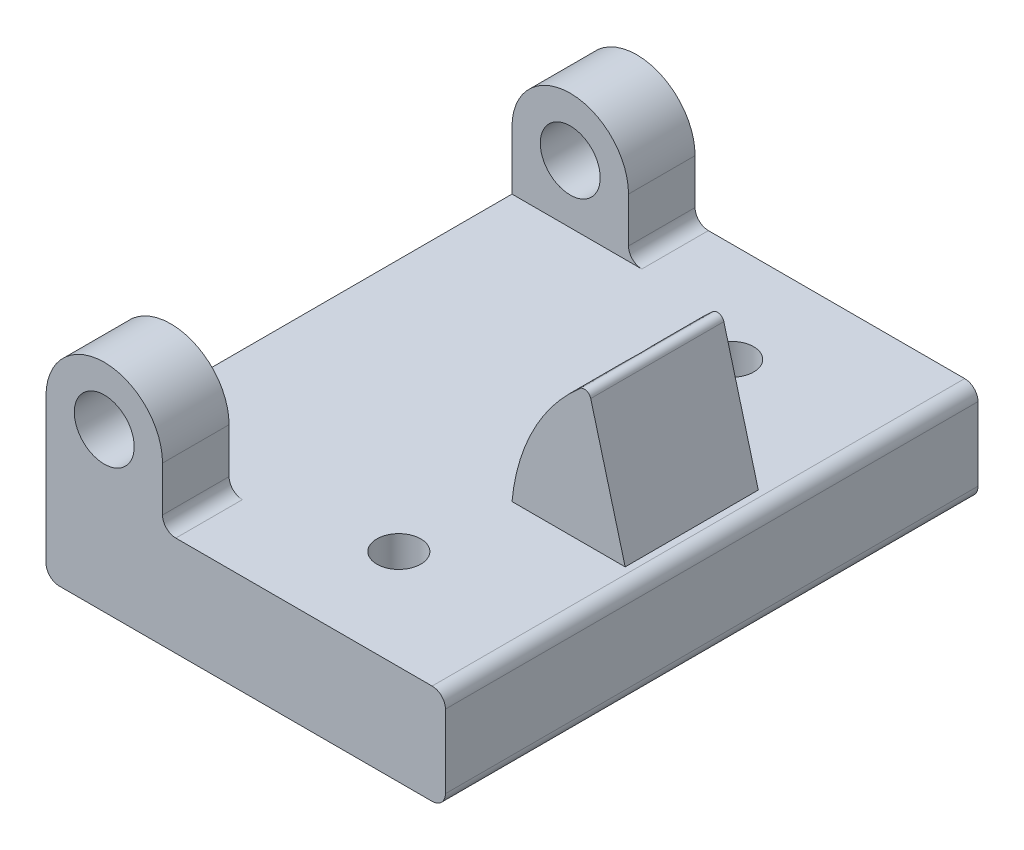
ISO-10303-21;
HEADER;
FILE_DESCRIPTION(('STEP AP214'),'2;1');
FILE_NAME('part.step','',(''),(''),'','','');
FILE_SCHEMA(('AUTOMOTIVE_DESIGN { 1 0 10303 214 1 1 1 1 }'));
ENDSEC;
DATA;
#1=APPLICATION_CONTEXT('core data for automotive mechanical design processes');
#2=APPLICATION_PROTOCOL_DEFINITION('international standard','automotive_design',2000,#1);
#3=PRODUCT_CONTEXT('',#1,'mechanical');
#4=PRODUCT('Part','Part','',(#3));
#5=PRODUCT_RELATED_PRODUCT_CATEGORY('part','',(#4));
#6=PRODUCT_DEFINITION_FORMATION('','',#4);
#7=PRODUCT_DEFINITION_CONTEXT('part definition',#1,'design');
#8=PRODUCT_DEFINITION('design','',#6,#7);
#9=PRODUCT_DEFINITION_SHAPE('','',#8);
#10=(LENGTH_UNIT() NAMED_UNIT(*) SI_UNIT(.MILLI.,.METRE.));
#11=(NAMED_UNIT(*) PLANE_ANGLE_UNIT() SI_UNIT($,.RADIAN.));
#12=(NAMED_UNIT(*) SI_UNIT($,.STERADIAN.) SOLID_ANGLE_UNIT());
#13=UNCERTAINTY_MEASURE_WITH_UNIT(LENGTH_MEASURE(1.E-05),#10,'distance_accuracy_value','');
#14=(GEOMETRIC_REPRESENTATION_CONTEXT(3) GLOBAL_UNCERTAINTY_ASSIGNED_CONTEXT((#13)) GLOBAL_UNIT_ASSIGNED_CONTEXT((#10,
#11,#12)) REPRESENTATION_CONTEXT('',''));
#15=CARTESIAN_POINT('',(0.,0.,0.));
#16=DIRECTION('',(0.,0.,1.));
#17=DIRECTION('',(1.,0.,0.));
#18=AXIS2_PLACEMENT_3D('',#15,#16,#17);
#19=CARTESIAN_POINT('',(58.,15.,-10.));
#20=DIRECTION('',(0.,1.,0.));
#21=DIRECTION('',(-1.,0.,0.));
#22=AXIS2_PLACEMENT_3D('',#19,#20,#21);
#23=PLANE('',#22);
#24=CARTESIAN_POINT('',(38.,15.,-15.));
#25=DIRECTION('',(0.,1.,0.));
#26=DIRECTION('',(0.,0.,1.));
#27=AXIS2_PLACEMENT_3D('',#24,#25,#26);
#28=CIRCLE('',#27,3.29999999999998);
#29=CARTESIAN_POINT('',(38.,15.,-11.7));
#30=VERTEX_POINT('',#29);
#31=EDGE_CURVE('E486',#30,#30,#28,.T.);
#32=ORIENTED_EDGE('',*,*,#31,.F.);
#33=EDGE_LOOP('',(#32));
#34=FACE_BOUND('',#33,.T.);
#35=CARTESIAN_POINT('',(38.,15.,-65.));
#36=DIRECTION('',(0.,1.,0.));
#37=DIRECTION('',(0.,0.,1.));
#38=AXIS2_PLACEMENT_3D('',#35,#36,#37);
#39=CIRCLE('',#38,3.29999999999998);
#40=CARTESIAN_POINT('',(38.,15.,-61.7));
#41=VERTEX_POINT('',#40);
#42=EDGE_CURVE('E183',#41,#41,#39,.T.);
#43=ORIENTED_EDGE('',*,*,#42,.F.);
#44=EDGE_LOOP('',(#43));
#45=FACE_BOUND('',#44,.T.);
#46=DIRECTION('',(-1.,0.,0.));
#47=VECTOR('',#46,1.);
#48=CARTESIAN_POINT('',(58.,15.,0.));
#49=LINE('',#48,#47);
#50=CARTESIAN_POINT('',(58.,15.,0.));
#51=VERTEX_POINT('',#50);
#52=CARTESIAN_POINT('',(19.5,15.,0.));
#53=VERTEX_POINT('',#52);
#54=EDGE_CURVE('E313',#51,#53,#49,.T.);
#55=ORIENTED_EDGE('',*,*,#54,.F.);
#56=DIRECTION('',(0.,0.,1.));
#57=VECTOR('',#56,1.);
#58=CARTESIAN_POINT('',(58.,15.,-10.));
#59=LINE('',#58,#57);
#60=CARTESIAN_POINT('',(58.,15.,-80.));
#61=VERTEX_POINT('',#60);
#62=EDGE_CURVE('E324',#61,#51,#59,.T.);
#63=ORIENTED_EDGE('',*,*,#62,.F.);
#64=DIRECTION('',(-1.,0.,0.));
#65=VECTOR('',#64,1.);
#66=CARTESIAN_POINT('',(58.,15.,-80.));
#67=LINE('',#66,#65);
#68=CARTESIAN_POINT('',(19.5,15.,-80.));
#69=VERTEX_POINT('',#68);
#70=EDGE_CURVE('E242',#61,#69,#67,.T.);
#71=ORIENTED_EDGE('',*,*,#70,.T.);
#72=DIRECTION('',(0.,0.,-1.));
#73=VECTOR('',#72,1.);
#74=CARTESIAN_POINT('',(19.5,15.,-70.));
#75=LINE('',#74,#73);
#76=CARTESIAN_POINT('',(19.5,15.,-70.));
#77=VERTEX_POINT('',#76);
#78=EDGE_CURVE('E265',#77,#69,#75,.T.);
#79=ORIENTED_EDGE('',*,*,#78,.F.);
#80=DIRECTION('',(1.,0.,0.));
#81=VECTOR('',#80,1.);
#82=CARTESIAN_POINT('',(58.,15.,-70.));
#83=LINE('',#82,#81);
#84=CARTESIAN_POINT('',(0.,15.,-70.));
#85=VERTEX_POINT('',#84);
#86=EDGE_CURVE('E264',#85,#77,#83,.T.);
#87=ORIENTED_EDGE('',*,*,#86,.F.);
#88=DIRECTION('',(0.,0.,1.));
#89=VECTOR('',#88,1.);
#90=CARTESIAN_POINT('',(0.,15.,-40.));
#91=LINE('',#90,#89);
#92=CARTESIAN_POINT('',(0.,15.,-10.));
#93=VERTEX_POINT('',#92);
#94=EDGE_CURVE('E276',#85,#93,#91,.T.);
#95=ORIENTED_EDGE('',*,*,#94,.T.);
#96=DIRECTION('',(1.,0.,0.));
#97=VECTOR('',#96,1.);
#98=CARTESIAN_POINT('',(58.,15.,-10.));
#99=LINE('',#98,#97);
#100=CARTESIAN_POINT('',(19.5,15.,-10.));
#101=VERTEX_POINT('',#100);
#102=EDGE_CURVE('E274',#93,#101,#99,.T.);
#103=ORIENTED_EDGE('',*,*,#102,.T.);
#104=DIRECTION('',(0.,0.,1.));
#105=VECTOR('',#104,1.);
#106=CARTESIAN_POINT('',(19.5,15.,-10.));
#107=LINE('',#106,#105);
#108=EDGE_CURVE('E322',#101,#53,#107,.T.);
#109=ORIENTED_EDGE('',*,*,#108,.T.);
#110=EDGE_LOOP('',(#55,#63,#71,#79,#87,#95,#103,#109));
#111=FACE_BOUND('',#110,.T.);
#112=DIRECTION('',(0.,0.,1.));
#113=VECTOR('',#112,1.);
#114=CARTESIAN_POINT('',(40.,15.,-50.));
#115=LINE('',#114,#113);
#116=CARTESIAN_POINT('',(40.,15.,-50.));
#117=VERTEX_POINT('',#116);
#118=CARTESIAN_POINT('',(40.,15.,-30.));
#119=VERTEX_POINT('',#118);
#120=EDGE_CURVE('E59',#117,#119,#115,.T.);
#121=ORIENTED_EDGE('',*,*,#120,.F.);
#122=DIRECTION('',(-1.,0.,0.));
#123=VECTOR('',#122,1.);
#124=CARTESIAN_POINT('',(57.,15.,-50.));
#125=LINE('',#124,#123);
#126=CARTESIAN_POINT('',(57.,15.,-50.));
#127=VERTEX_POINT('',#126);
#128=EDGE_CURVE('E54',#127,#117,#125,.T.);
#129=ORIENTED_EDGE('',*,*,#128,.F.);
#130=DIRECTION('',(0.,0.,1.));
#131=VECTOR('',#130,1.);
#132=CARTESIAN_POINT('',(57.,15.,-50.));
#133=LINE('',#132,#131);
#134=CARTESIAN_POINT('',(57.,15.,-30.));
#135=VERTEX_POINT('',#134);
#136=EDGE_CURVE('E221',#127,#135,#133,.T.);
#137=ORIENTED_EDGE('',*,*,#136,.T.);
#138=DIRECTION('',(-1.,0.,0.));
#139=VECTOR('',#138,1.);
#140=CARTESIAN_POINT('',(57.,15.,-30.));
#141=LINE('',#140,#139);
#142=EDGE_CURVE('E210',#135,#119,#141,.T.);
#143=ORIENTED_EDGE('',*,*,#142,.T.);
#144=EDGE_LOOP('',(#121,#129,#137,#143));
#145=FACE_BOUND('',#144,.T.);
#146=ADVANCED_FACE('F32',(#34,#45,#111,#145),#23,.T.);
#147=CARTESIAN_POINT('',(8.75,23.75,-10.));
#148=DIRECTION('',(0.,0.,1.));
#149=DIRECTION('',(1.,0.,0.));
#150=AXIS2_PLACEMENT_3D('',#147,#148,#149);
#151=PLANE('',#150);
#152=CARTESIAN_POINT('',(8.75,23.75,-10.));
#153=DIRECTION('',(0.,0.,1.));
#154=DIRECTION('',(1.,0.,0.));
#155=AXIS2_PLACEMENT_3D('',#152,#153,#154);
#156=CIRCLE('',#155,4.49999999999998);
#157=CARTESIAN_POINT('',(13.25,23.75,-10.));
#158=VERTEX_POINT('',#157);
#159=EDGE_CURVE('E195',#158,#158,#156,.T.);
#160=ORIENTED_EDGE('',*,*,#159,.T.);
#161=EDGE_LOOP('',(#160));
#162=FACE_BOUND('',#161,.T.);
#163=ORIENTED_EDGE('',*,*,#102,.F.);
#164=DIRECTION('',(0.,-1.,0.));
#165=VECTOR('',#164,1.);
#166=CARTESIAN_POINT('',(0.,23.75,-10.));
#167=LINE('',#166,#165);
#168=CARTESIAN_POINT('',(0.,23.75,-10.));
#169=VERTEX_POINT('',#168);
#170=EDGE_CURVE('E282',#169,#93,#167,.T.);
#171=ORIENTED_EDGE('',*,*,#170,.F.);
#172=CARTESIAN_POINT('',(8.75,23.75,-10.));
#173=DIRECTION('',(0.,0.,1.));
#174=DIRECTION('',(1.,0.,0.));
#175=AXIS2_PLACEMENT_3D('',#172,#173,#174);
#176=CIRCLE('',#175,8.75);
#177=CARTESIAN_POINT('',(17.5,23.75,-10.));
#178=VERTEX_POINT('',#177);
#179=EDGE_CURVE('E279',#178,#169,#176,.T.);
#180=ORIENTED_EDGE('',*,*,#179,.F.);
#181=DIRECTION('',(0.,1.,0.));
#182=VECTOR('',#181,1.);
#183=CARTESIAN_POINT('',(17.5,17.,-10.));
#184=LINE('',#183,#182);
#185=CARTESIAN_POINT('',(17.5,17.,-10.));
#186=VERTEX_POINT('',#185);
#187=EDGE_CURVE('E289',#186,#178,#184,.T.);
#188=ORIENTED_EDGE('',*,*,#187,.F.);
#189=CARTESIAN_POINT('',(19.5,17.,-10.));
#190=DIRECTION('',(0.,0.,-1.));
#191=DIRECTION('',(-1.,0.,0.));
#192=AXIS2_PLACEMENT_3D('',#189,#190,#191);
#193=CIRCLE('',#192,2.);
#194=EDGE_CURVE('E286',#101,#186,#193,.T.);
#195=ORIENTED_EDGE('',*,*,#194,.F.);
#196=EDGE_LOOP('',(#163,#171,#180,#188,#195));
#197=FACE_BOUND('',#196,.T.);
#198=ADVANCED_FACE('F352',(#162,#197),#151,.F.);
#199=CARTESIAN_POINT('',(8.75,23.75,-10.));
#200=DIRECTION('',(0.,0.,1.));
#201=DIRECTION('',(1.,0.,0.));
#202=AXIS2_PLACEMENT_3D('',#199,#200,#201);
#203=CYLINDRICAL_SURFACE('',#202,8.75);
#204=CARTESIAN_POINT('',(8.75,23.75,0.));
#205=DIRECTION('',(0.,0.,1.));
#206=DIRECTION('',(1.,0.,0.));
#207=AXIS2_PLACEMENT_3D('',#204,#205,#206);
#208=CIRCLE('',#207,8.75);
#209=CARTESIAN_POINT('',(17.5,23.75,0.));
#210=VERTEX_POINT('',#209);
#211=CARTESIAN_POINT('',(0.,23.75,0.));
#212=VERTEX_POINT('',#211);
#213=EDGE_CURVE('E278',#210,#212,#208,.T.);
#214=ORIENTED_EDGE('',*,*,#213,.F.);
#215=DIRECTION('',(0.,0.,1.));
#216=VECTOR('',#215,1.);
#217=CARTESIAN_POINT('',(17.5,23.75,-10.));
#218=LINE('',#217,#216);
#219=EDGE_CURVE('E11',#178,#210,#218,.T.);
#220=ORIENTED_EDGE('',*,*,#219,.F.);
#221=ORIENTED_EDGE('',*,*,#179,.T.);
#222=DIRECTION('',(0.,0.,1.));
#223=VECTOR('',#222,1.);
#224=CARTESIAN_POINT('',(0.,23.75,-10.));
#225=LINE('',#224,#223);
#226=EDGE_CURVE('E292',#169,#212,#225,.T.);
#227=ORIENTED_EDGE('',*,*,#226,.T.);
#228=EDGE_LOOP('',(#214,#220,#221,#227));
#229=FACE_BOUND('',#228,.T.);
#230=ADVANCED_FACE('F34',(#229),#203,.T.);
#231=CARTESIAN_POINT('',(17.5,17.,-10.));
#232=DIRECTION('',(1.,0.,0.));
#233=DIRECTION('',(0.,0.,-1.));
#234=AXIS2_PLACEMENT_3D('',#231,#232,#233);
#235=PLANE('',#234);
#236=DIRECTION('',(0.,1.,0.));
#237=VECTOR('',#236,1.);
#238=CARTESIAN_POINT('',(17.5,17.,0.));
#239=LINE('',#238,#237);
#240=CARTESIAN_POINT('',(17.5,17.,0.));
#241=VERTEX_POINT('',#240);
#242=EDGE_CURVE('E283',#241,#210,#239,.T.);
#243=ORIENTED_EDGE('',*,*,#242,.F.);
#244=DIRECTION('',(0.,0.,1.));
#245=VECTOR('',#244,1.);
#246=CARTESIAN_POINT('',(17.5,17.,-10.));
#247=LINE('',#246,#245);
#248=EDGE_CURVE('E46',#186,#241,#247,.T.);
#249=ORIENTED_EDGE('',*,*,#248,.F.);
#250=ORIENTED_EDGE('',*,*,#187,.T.);
#251=ORIENTED_EDGE('',*,*,#219,.T.);
#252=EDGE_LOOP('',(#243,#249,#250,#251));
#253=FACE_BOUND('',#252,.T.);
#254=ADVANCED_FACE('F348',(#253),#235,.T.);
#255=CARTESIAN_POINT('',(19.5,17.,-10.));
#256=DIRECTION('',(0.,0.,1.));
#257=DIRECTION('',(1.,0.,0.));
#258=AXIS2_PLACEMENT_3D('',#255,#256,#257);
#259=CYLINDRICAL_SURFACE('',#258,2.);
#260=CARTESIAN_POINT('',(19.5,17.,0.));
#261=DIRECTION('',(0.,0.,-1.));
#262=DIRECTION('',(-1.,0.,0.));
#263=AXIS2_PLACEMENT_3D('',#260,#261,#262);
#264=CIRCLE('',#263,2.);
#265=EDGE_CURVE('E316',#53,#241,#264,.T.);
#266=ORIENTED_EDGE('',*,*,#265,.F.);
#267=ORIENTED_EDGE('',*,*,#108,.F.);
#268=ORIENTED_EDGE('',*,*,#194,.T.);
#269=ORIENTED_EDGE('',*,*,#248,.T.);
#270=EDGE_LOOP('',(#266,#267,#268,#269));
#271=FACE_BOUND('',#270,.T.);
#272=ADVANCED_FACE('F392',(#271),#259,.F.);
#273=CARTESIAN_POINT('',(58.,13.,-10.));
#274=DIRECTION('',(0.,0.,1.));
#275=DIRECTION('',(1.,0.,0.));
#276=AXIS2_PLACEMENT_3D('',#273,#274,#275);
#277=CYLINDRICAL_SURFACE('',#276,2.);
#278=CARTESIAN_POINT('',(58.,13.,0.));
#279=DIRECTION('',(0.,0.,1.));
#280=DIRECTION('',(1.,0.,0.));
#281=AXIS2_PLACEMENT_3D('',#278,#279,#280);
#282=CIRCLE('',#281,2.);
#283=CARTESIAN_POINT('',(60.,13.,0.));
#284=VERTEX_POINT('',#283);
#285=EDGE_CURVE('E310',#284,#51,#282,.T.);
#286=ORIENTED_EDGE('',*,*,#285,.F.);
#287=DIRECTION('',(0.,0.,1.));
#288=VECTOR('',#287,1.);
#289=CARTESIAN_POINT('',(60.,13.,-10.));
#290=LINE('',#289,#288);
#291=CARTESIAN_POINT('',(60.,13.,-80.));
#292=VERTEX_POINT('',#291);
#293=EDGE_CURVE('E326',#292,#284,#290,.T.);
#294=ORIENTED_EDGE('',*,*,#293,.F.);
#295=CARTESIAN_POINT('',(58.,13.,-80.));
#296=DIRECTION('',(0.,0.,1.));
#297=DIRECTION('',(1.,0.,0.));
#298=AXIS2_PLACEMENT_3D('',#295,#296,#297);
#299=CIRCLE('',#298,2.);
#300=EDGE_CURVE('E244',#292,#61,#299,.T.);
#301=ORIENTED_EDGE('',*,*,#300,.T.);
#302=ORIENTED_EDGE('',*,*,#62,.T.);
#303=EDGE_LOOP('',(#286,#294,#301,#302));
#304=FACE_BOUND('',#303,.T.);
#305=ADVANCED_FACE('F387',(#304),#277,.T.);
#306=CARTESIAN_POINT('',(60.,2.,-10.));
#307=DIRECTION('',(1.,0.,0.));
#308=DIRECTION('',(0.,0.,-1.));
#309=AXIS2_PLACEMENT_3D('',#306,#307,#308);
#310=PLANE('',#309);
#311=DIRECTION('',(0.,1.,0.));
#312=VECTOR('',#311,1.);
#313=CARTESIAN_POINT('',(60.,2.,0.));
#314=LINE('',#313,#312);
#315=CARTESIAN_POINT('',(60.,2.,0.));
#316=VERTEX_POINT('',#315);
#317=EDGE_CURVE('E307',#316,#284,#314,.T.);
#318=ORIENTED_EDGE('',*,*,#317,.F.);
#319=DIRECTION('',(0.,0.,1.));
#320=VECTOR('',#319,1.);
#321=CARTESIAN_POINT('',(60.,2.,-10.));
#322=LINE('',#321,#320);
#323=CARTESIAN_POINT('',(60.,2.,-80.));
#324=VERTEX_POINT('',#323);
#325=EDGE_CURVE('E328',#324,#316,#322,.T.);
#326=ORIENTED_EDGE('',*,*,#325,.F.);
#327=DIRECTION('',(0.,1.,0.));
#328=VECTOR('',#327,1.);
#329=CARTESIAN_POINT('',(60.,2.,-80.));
#330=LINE('',#329,#328);
#331=EDGE_CURVE('E247',#324,#292,#330,.T.);
#332=ORIENTED_EDGE('',*,*,#331,.T.);
#333=ORIENTED_EDGE('',*,*,#293,.T.);
#334=EDGE_LOOP('',(#318,#326,#332,#333));
#335=FACE_BOUND('',#334,.T.);
#336=ADVANCED_FACE('F384',(#335),#310,.T.);
#337=CARTESIAN_POINT('',(58.,2.,-10.));
#338=DIRECTION('',(0.,0.,1.));
#339=DIRECTION('',(1.,0.,0.));
#340=AXIS2_PLACEMENT_3D('',#337,#338,#339);
#341=CYLINDRICAL_SURFACE('',#340,2.);
#342=CARTESIAN_POINT('',(58.,2.,0.));
#343=DIRECTION('',(0.,0.,1.));
#344=DIRECTION('',(1.,0.,0.));
#345=AXIS2_PLACEMENT_3D('',#342,#343,#344);
#346=CIRCLE('',#345,2.);
#347=CARTESIAN_POINT('',(58.,0.,0.));
#348=VERTEX_POINT('',#347);
#349=EDGE_CURVE('E304',#348,#316,#346,.T.);
#350=ORIENTED_EDGE('',*,*,#349,.F.);
#351=DIRECTION('',(0.,0.,1.));
#352=VECTOR('',#351,1.);
#353=CARTESIAN_POINT('',(58.,0.,-10.));
#354=LINE('',#353,#352);
#355=CARTESIAN_POINT('',(58.,0.,-80.));
#356=VERTEX_POINT('',#355);
#357=EDGE_CURVE('E330',#356,#348,#354,.T.);
#358=ORIENTED_EDGE('',*,*,#357,.F.);
#359=CARTESIAN_POINT('',(58.,2.,-80.));
#360=DIRECTION('',(0.,0.,1.));
#361=DIRECTION('',(1.,0.,0.));
#362=AXIS2_PLACEMENT_3D('',#359,#360,#361);
#363=CIRCLE('',#362,2.);
#364=EDGE_CURVE('E250',#356,#324,#363,.T.);
#365=ORIENTED_EDGE('',*,*,#364,.T.);
#366=ORIENTED_EDGE('',*,*,#325,.T.);
#367=EDGE_LOOP('',(#350,#358,#365,#366));
#368=FACE_BOUND('',#367,.T.);
#369=ADVANCED_FACE('F380',(#368),#341,.T.);
#370=CARTESIAN_POINT('',(2.00000000000001,0.,-10.));
#371=DIRECTION('',(0.,-1.,0.));
#372=DIRECTION('',(0.,0.,-1.));
#373=AXIS2_PLACEMENT_3D('',#370,#371,#372);
#374=PLANE('',#373);
#375=CARTESIAN_POINT('',(38.,0.,-15.));
#376=DIRECTION('',(0.,1.,0.));
#377=DIRECTION('',(0.,0.,1.));
#378=AXIS2_PLACEMENT_3D('',#375,#376,#377);
#379=CIRCLE('',#378,3.3);
#380=CARTESIAN_POINT('',(38.,0.,-11.7));
#381=VERTEX_POINT('',#380);
#382=EDGE_CURVE('E484',#381,#381,#379,.T.);
#383=ORIENTED_EDGE('',*,*,#382,.T.);
#384=EDGE_LOOP('',(#383));
#385=FACE_BOUND('',#384,.T.);
#386=CARTESIAN_POINT('',(38.,0.,-65.));
#387=DIRECTION('',(0.,1.,0.));
#388=DIRECTION('',(0.,0.,1.));
#389=AXIS2_PLACEMENT_3D('',#386,#387,#388);
#390=CIRCLE('',#389,3.3);
#391=CARTESIAN_POINT('',(38.,0.,-61.7));
#392=VERTEX_POINT('',#391);
#393=EDGE_CURVE('E178',#392,#392,#390,.T.);
#394=ORIENTED_EDGE('',*,*,#393,.T.);
#395=EDGE_LOOP('',(#394));
#396=FACE_BOUND('',#395,.T.);
#397=DIRECTION('',(1.,0.,0.));
#398=VECTOR('',#397,1.);
#399=CARTESIAN_POINT('',(2.00000000000001,0.,0.));
#400=LINE('',#399,#398);
#401=CARTESIAN_POINT('',(2.00000000000001,0.,0.));
#402=VERTEX_POINT('',#401);
#403=EDGE_CURVE('E301',#402,#348,#400,.T.);
#404=ORIENTED_EDGE('',*,*,#403,.F.);
#405=DIRECTION('',(0.,0.,1.));
#406=VECTOR('',#405,1.);
#407=CARTESIAN_POINT('',(2.00000000000001,0.,-10.));
#408=LINE('',#407,#406);
#409=CARTESIAN_POINT('',(2.00000000000001,0.,-80.));
#410=VERTEX_POINT('',#409);
#411=EDGE_CURVE('E332',#410,#402,#408,.T.);
#412=ORIENTED_EDGE('',*,*,#411,.F.);
#413=DIRECTION('',(1.,0.,0.));
#414=VECTOR('',#413,1.);
#415=CARTESIAN_POINT('',(2.00000000000001,0.,-80.));
#416=LINE('',#415,#414);
#417=EDGE_CURVE('E253',#410,#356,#416,.T.);
#418=ORIENTED_EDGE('',*,*,#417,.T.);
#419=ORIENTED_EDGE('',*,*,#357,.T.);
#420=EDGE_LOOP('',(#404,#412,#418,#419));
#421=FACE_BOUND('',#420,.T.);
#422=ADVANCED_FACE('F378',(#385,#396,#421),#374,.T.);
#423=CARTESIAN_POINT('',(2.,2.,-10.));
#424=DIRECTION('',(0.,0.,1.));
#425=DIRECTION('',(1.,0.,0.));
#426=AXIS2_PLACEMENT_3D('',#423,#424,#425);
#427=CYLINDRICAL_SURFACE('',#426,2.);
#428=CARTESIAN_POINT('',(2.,2.,0.));
#429=DIRECTION('',(0.,0.,1.));
#430=DIRECTION('',(1.,0.,0.));
#431=AXIS2_PLACEMENT_3D('',#428,#429,#430);
#432=CIRCLE('',#431,2.);
#433=CARTESIAN_POINT('',(0.,2.00000000000001,0.));
#434=VERTEX_POINT('',#433);
#435=EDGE_CURVE('E298',#434,#402,#432,.T.);
#436=ORIENTED_EDGE('',*,*,#435,.F.);
#437=DIRECTION('',(0.,0.,1.));
#438=VECTOR('',#437,1.);
#439=CARTESIAN_POINT('',(0.,2.00000000000001,-10.));
#440=LINE('',#439,#438);
#441=CARTESIAN_POINT('',(0.,2.00000000000001,-80.));
#442=VERTEX_POINT('',#441);
#443=EDGE_CURVE('E334',#442,#434,#440,.T.);
#444=ORIENTED_EDGE('',*,*,#443,.F.);
#445=CARTESIAN_POINT('',(2.,2.,-80.));
#446=DIRECTION('',(0.,0.,1.));
#447=DIRECTION('',(1.,0.,0.));
#448=AXIS2_PLACEMENT_3D('',#445,#446,#447);
#449=CIRCLE('',#448,2.);
#450=EDGE_CURVE('E256',#442,#410,#449,.T.);
#451=ORIENTED_EDGE('',*,*,#450,.T.);
#452=ORIENTED_EDGE('',*,*,#411,.T.);
#453=EDGE_LOOP('',(#436,#444,#451,#452));
#454=FACE_BOUND('',#453,.T.);
#455=ADVANCED_FACE('F374',(#454),#427,.T.);
#456=CARTESIAN_POINT('',(0.,23.75,-10.));
#457=DIRECTION('',(-1.,0.,0.));
#458=DIRECTION('',(0.,0.,1.));
#459=AXIS2_PLACEMENT_3D('',#456,#457,#458);
#460=PLANE('',#459);
#461=DIRECTION('',(0.,-1.,0.));
#462=VECTOR('',#461,1.);
#463=CARTESIAN_POINT('',(0.,23.75,0.));
#464=LINE('',#463,#462);
#465=EDGE_CURVE('E295',#212,#434,#464,.T.);
#466=ORIENTED_EDGE('',*,*,#465,.F.);
#467=ORIENTED_EDGE('',*,*,#226,.F.);
#468=ORIENTED_EDGE('',*,*,#170,.T.);
#469=ORIENTED_EDGE('',*,*,#94,.F.);
#470=DIRECTION('',(0.,-1.,0.));
#471=VECTOR('',#470,1.);
#472=CARTESIAN_POINT('',(0.,23.75,-70.));
#473=LINE('',#472,#471);
#474=CARTESIAN_POINT('',(0.,23.75,-70.));
#475=VERTEX_POINT('',#474);
#476=EDGE_CURVE('E232',#475,#85,#473,.T.);
#477=ORIENTED_EDGE('',*,*,#476,.F.);
#478=DIRECTION('',(0.,0.,-1.));
#479=VECTOR('',#478,1.);
#480=CARTESIAN_POINT('',(0.,23.75,-70.));
#481=LINE('',#480,#479);
#482=CARTESIAN_POINT('',(0.,23.75,-80.));
#483=VERTEX_POINT('',#482);
#484=EDGE_CURVE('E261',#475,#483,#481,.T.);
#485=ORIENTED_EDGE('',*,*,#484,.T.);
#486=DIRECTION('',(0.,-1.,0.));
#487=VECTOR('',#486,1.);
#488=CARTESIAN_POINT('',(0.,23.75,-80.));
#489=LINE('',#488,#487);
#490=EDGE_CURVE('E228',#483,#442,#489,.T.);
#491=ORIENTED_EDGE('',*,*,#490,.T.);
#492=ORIENTED_EDGE('',*,*,#443,.T.);
#493=EDGE_LOOP('',(#466,#467,#468,#469,#477,#485,#491,#492));
#494=FACE_BOUND('',#493,.T.);
#495=ADVANCED_FACE('F341',(#494),#460,.T.);
#496=CARTESIAN_POINT('',(8.75,23.75,0.));
#497=DIRECTION('',(0.,0.,1.));
#498=DIRECTION('',(1.,0.,0.));
#499=AXIS2_PLACEMENT_3D('',#496,#497,#498);
#500=PLANE('',#499);
#501=CARTESIAN_POINT('',(8.75,23.75,0.));
#502=DIRECTION('',(0.,0.,1.));
#503=DIRECTION('',(1.,0.,0.));
#504=AXIS2_PLACEMENT_3D('',#501,#502,#503);
#505=CIRCLE('',#504,4.49999999999999);
#506=CARTESIAN_POINT('',(13.25,23.75,0.));
#507=VERTEX_POINT('',#506);
#508=EDGE_CURVE('E181',#507,#507,#505,.T.);
#509=ORIENTED_EDGE('',*,*,#508,.F.);
#510=EDGE_LOOP('',(#509));
#511=FACE_BOUND('',#510,.T.);
#512=ORIENTED_EDGE('',*,*,#213,.T.);
#513=ORIENTED_EDGE('',*,*,#465,.T.);
#514=ORIENTED_EDGE('',*,*,#435,.T.);
#515=ORIENTED_EDGE('',*,*,#403,.T.);
#516=ORIENTED_EDGE('',*,*,#349,.T.);
#517=ORIENTED_EDGE('',*,*,#317,.T.);
#518=ORIENTED_EDGE('',*,*,#285,.T.);
#519=ORIENTED_EDGE('',*,*,#54,.T.);
#520=ORIENTED_EDGE('',*,*,#265,.T.);
#521=ORIENTED_EDGE('',*,*,#242,.T.);
#522=EDGE_LOOP('',(#512,#513,#514,#515,#516,#517,#518,#519,#520,#521));
#523=FACE_BOUND('',#522,.T.);
#524=ADVANCED_FACE('F344',(#511,#523),#500,.T.);
#525=CARTESIAN_POINT('',(8.75,23.75,-70.));
#526=DIRECTION('',(0.,0.,-1.));
#527=DIRECTION('',(-1.,0.,0.));
#528=AXIS2_PLACEMENT_3D('',#525,#526,#527);
#529=CYLINDRICAL_SURFACE('',#528,8.75);
#530=CARTESIAN_POINT('',(8.75,23.75,-80.));
#531=DIRECTION('',(0.,0.,1.));
#532=DIRECTION('',(1.,0.,0.));
#533=AXIS2_PLACEMENT_3D('',#530,#531,#532);
#534=CIRCLE('',#533,8.75);
#535=CARTESIAN_POINT('',(17.5,23.75,-80.));
#536=VERTEX_POINT('',#535);
#537=EDGE_CURVE('E223',#536,#483,#534,.T.);
#538=ORIENTED_EDGE('',*,*,#537,.T.);
#539=ORIENTED_EDGE('',*,*,#484,.F.);
#540=CARTESIAN_POINT('',(8.75,23.75,-70.));
#541=DIRECTION('',(0.,0.,1.));
#542=DIRECTION('',(1.,0.,0.));
#543=AXIS2_PLACEMENT_3D('',#540,#541,#542);
#544=CIRCLE('',#543,8.75);
#545=CARTESIAN_POINT('',(17.5,23.75,-70.));
#546=VERTEX_POINT('',#545);
#547=EDGE_CURVE('E224',#546,#475,#544,.T.);
#548=ORIENTED_EDGE('',*,*,#547,.F.);
#549=DIRECTION('',(0.,0.,-1.));
#550=VECTOR('',#549,1.);
#551=CARTESIAN_POINT('',(17.5,23.75,-70.));
#552=LINE('',#551,#550);
#553=EDGE_CURVE('E235',#546,#536,#552,.T.);
#554=ORIENTED_EDGE('',*,*,#553,.T.);
#555=EDGE_LOOP('',(#538,#539,#548,#554));
#556=FACE_BOUND('',#555,.T.);
#557=ADVANCED_FACE('F366',(#556),#529,.T.);
#558=CARTESIAN_POINT('',(19.5,17.,-70.));
#559=DIRECTION('',(0.,0.,-1.));
#560=DIRECTION('',(-1.,0.,0.));
#561=AXIS2_PLACEMENT_3D('',#558,#559,#560);
#562=CYLINDRICAL_SURFACE('',#561,2.);
#563=CARTESIAN_POINT('',(19.5,17.,-80.));
#564=DIRECTION('',(0.,0.,-1.));
#565=DIRECTION('',(-1.,0.,0.));
#566=AXIS2_PLACEMENT_3D('',#563,#564,#565);
#567=CIRCLE('',#566,2.);
#568=CARTESIAN_POINT('',(17.5,17.,-80.));
#569=VERTEX_POINT('',#568);
#570=EDGE_CURVE('E240',#69,#569,#567,.T.);
#571=ORIENTED_EDGE('',*,*,#570,.T.);
#572=DIRECTION('',(0.,0.,-1.));
#573=VECTOR('',#572,1.);
#574=CARTESIAN_POINT('',(17.5,17.,-70.));
#575=LINE('',#574,#573);
#576=CARTESIAN_POINT('',(17.5,17.,-70.));
#577=VERTEX_POINT('',#576);
#578=EDGE_CURVE('E268',#577,#569,#575,.T.);
#579=ORIENTED_EDGE('',*,*,#578,.F.);
#580=CARTESIAN_POINT('',(19.5,17.,-70.));
#581=DIRECTION('',(0.,0.,-1.));
#582=DIRECTION('',(-1.,0.,0.));
#583=AXIS2_PLACEMENT_3D('',#580,#581,#582);
#584=CIRCLE('',#583,2.);
#585=EDGE_CURVE('E230',#77,#577,#584,.T.);
#586=ORIENTED_EDGE('',*,*,#585,.F.);
#587=ORIENTED_EDGE('',*,*,#78,.T.);
#588=EDGE_LOOP('',(#571,#579,#586,#587));
#589=FACE_BOUND('',#588,.T.);
#590=ADVANCED_FACE('F429',(#589),#562,.F.);
#591=CARTESIAN_POINT('',(17.5,17.,-70.));
#592=DIRECTION('',(-1.,0.,0.));
#593=DIRECTION('',(0.,0.,1.));
#594=AXIS2_PLACEMENT_3D('',#591,#592,#593);
#595=PLANE('',#594);
#596=DIRECTION('',(0.,1.,0.));
#597=VECTOR('',#596,1.);
#598=CARTESIAN_POINT('',(17.5,17.,-80.));
#599=LINE('',#598,#597);
#600=EDGE_CURVE('E238',#569,#536,#599,.T.);
#601=ORIENTED_EDGE('',*,*,#600,.T.);
#602=ORIENTED_EDGE('',*,*,#553,.F.);
#603=DIRECTION('',(0.,1.,0.));
#604=VECTOR('',#603,1.);
#605=CARTESIAN_POINT('',(17.5,17.,-70.));
#606=LINE('',#605,#604);
#607=EDGE_CURVE('E227',#577,#546,#606,.T.);
#608=ORIENTED_EDGE('',*,*,#607,.F.);
#609=ORIENTED_EDGE('',*,*,#578,.T.);
#610=EDGE_LOOP('',(#601,#602,#608,#609));
#611=FACE_BOUND('',#610,.T.);
#612=ADVANCED_FACE('F433',(#611),#595,.F.);
#613=CARTESIAN_POINT('',(8.75,23.75,-70.));
#614=DIRECTION('',(0.,0.,-1.));
#615=DIRECTION('',(1.,0.,0.));
#616=AXIS2_PLACEMENT_3D('',#613,#614,#615);
#617=PLANE('',#616);
#618=CARTESIAN_POINT('',(8.75,23.75,-70.));
#619=DIRECTION('',(0.,0.,-1.));
#620=DIRECTION('',(-1.,0.,0.));
#621=AXIS2_PLACEMENT_3D('',#618,#619,#620);
#622=CIRCLE('',#621,4.49999999999998);
#623=CARTESIAN_POINT('',(4.25000000000002,23.75,-70.));
#624=VERTEX_POINT('',#623);
#625=EDGE_CURVE('E192',#624,#624,#622,.T.);
#626=ORIENTED_EDGE('',*,*,#625,.T.);
#627=EDGE_LOOP('',(#626));
#628=FACE_BOUND('',#627,.T.);
#629=ORIENTED_EDGE('',*,*,#476,.T.);
#630=ORIENTED_EDGE('',*,*,#86,.T.);
#631=ORIENTED_EDGE('',*,*,#585,.T.);
#632=ORIENTED_EDGE('',*,*,#607,.T.);
#633=ORIENTED_EDGE('',*,*,#547,.T.);
#634=EDGE_LOOP('',(#629,#630,#631,#632,#633));
#635=FACE_BOUND('',#634,.T.);
#636=ADVANCED_FACE('F360',(#628,#635),#617,.F.);
#637=CARTESIAN_POINT('',(8.75,23.75,-80.));
#638=DIRECTION('',(0.,0.,-1.));
#639=DIRECTION('',(1.,0.,0.));
#640=AXIS2_PLACEMENT_3D('',#637,#638,#639);
#641=PLANE('',#640);
#642=CARTESIAN_POINT('',(8.75,23.75,-80.));
#643=DIRECTION('',(0.,0.,1.));
#644=DIRECTION('',(1.,0.,0.));
#645=AXIS2_PLACEMENT_3D('',#642,#643,#644);
#646=CIRCLE('',#645,4.49999999999998);
#647=CARTESIAN_POINT('',(13.25,23.75,-80.));
#648=VERTEX_POINT('',#647);
#649=EDGE_CURVE('E189',#648,#648,#646,.T.);
#650=ORIENTED_EDGE('',*,*,#649,.T.);
#651=EDGE_LOOP('',(#650));
#652=FACE_BOUND('',#651,.T.);
#653=ORIENTED_EDGE('',*,*,#537,.F.);
#654=ORIENTED_EDGE('',*,*,#600,.F.);
#655=ORIENTED_EDGE('',*,*,#570,.F.);
#656=ORIENTED_EDGE('',*,*,#70,.F.);
#657=ORIENTED_EDGE('',*,*,#300,.F.);
#658=ORIENTED_EDGE('',*,*,#331,.F.);
#659=ORIENTED_EDGE('',*,*,#364,.F.);
#660=ORIENTED_EDGE('',*,*,#417,.F.);
#661=ORIENTED_EDGE('',*,*,#450,.F.);
#662=ORIENTED_EDGE('',*,*,#490,.F.);
#663=EDGE_LOOP('',(#653,#654,#655,#656,#657,#658,#659,#660,#661,#662));
#664=FACE_BOUND('',#663,.T.);
#665=ADVANCED_FACE('F371',(#652,#664),#641,.T.);
#666=CARTESIAN_POINT('',(57.,15.,-50.));
#667=DIRECTION('',(-0.965925826289069,-0.258819045102518,0.));
#668=DIRECTION('',(0.258819045102518,-0.965925826289069,0.));
#669=AXIS2_PLACEMENT_3D('',#666,#667,#668);
#670=PLANE('',#669);
#671=DIRECTION('',(0.258819045102518,-0.965925826289069,0.));
#672=VECTOR('',#671,1.);
#673=CARTESIAN_POINT('',(57.,15.,-30.));
#674=LINE('',#673,#672);
#675=CARTESIAN_POINT('',(51.8236190979497,34.3185165257814,-30.));
#676=VERTEX_POINT('',#675);
#677=EDGE_CURVE('E198',#676,#135,#674,.T.);
#678=ORIENTED_EDGE('',*,*,#677,.T.);
#679=ORIENTED_EDGE('',*,*,#136,.F.);
#680=DIRECTION('',(0.258819045102518,-0.965925826289069,0.));
#681=VECTOR('',#680,1.);
#682=CARTESIAN_POINT('',(57.,15.,-50.));
#683=LINE('',#682,#681);
#684=CARTESIAN_POINT('',(51.8236190979497,34.3185165257814,-50.));
#685=VERTEX_POINT('',#684);
#686=EDGE_CURVE('E199',#685,#127,#683,.T.);
#687=ORIENTED_EDGE('',*,*,#686,.F.);
#688=DIRECTION('',(0.,0.,1.));
#689=VECTOR('',#688,1.);
#690=CARTESIAN_POINT('',(51.8236190979497,34.3185165257814,-50.));
#691=LINE('',#690,#689);
#692=EDGE_CURVE('E207',#685,#676,#691,.T.);
#693=ORIENTED_EDGE('',*,*,#692,.T.);
#694=EDGE_LOOP('',(#678,#679,#687,#693));
#695=FACE_BOUND('',#694,.T.);
#696=ADVANCED_FACE('F442',(#695),#670,.F.);
#697=CARTESIAN_POINT('',(69.8649979450741,12.1571321274598,-50.));
#698=DIRECTION('',(0.,0.,1.));
#699=DIRECTION('',(1.,0.,0.));
#700=AXIS2_PLACEMENT_3D('',#697,#698,#699);
#701=CYLINDRICAL_SURFACE('',#700,30.);
#702=CARTESIAN_POINT('',(42.9648179094108,25.437957178973,-40.));
#703=CARTESIAN_POINT('',(42.9648131911691,25.4379467042636,-40.0960831979303));
#704=CARTESIAN_POINT('',(42.9687898575845,25.4460110852687,-40.1921379368443));
#705=CARTESIAN_POINT('',(42.984234009466,25.4772230858956,-40.3811633795309));
#706=CARTESIAN_POINT('',(42.9957098763967,25.500387582056,-40.4741305101323));
#707=CARTESIAN_POINT('',(43.0289749251226,25.5671872251038,-40.6786367661772));
#708=CARTESIAN_POINT('',(43.0526868666047,25.6146118926414,-40.7886004179525));
#709=CARTESIAN_POINT('',(43.1079953562329,25.7242454789378,-40.9987073970755));
#710=CARTESIAN_POINT('',(43.1396088175772,25.7864860974473,-41.098829008633));
#711=CARTESIAN_POINT('',(43.2029260314908,25.9098737595262,-41.273331330463));
#712=CARTESIAN_POINT('',(43.2337124499911,25.9694295124702,-41.3492033085922));
#713=CARTESIAN_POINT('',(43.2986434612005,26.0939086130787,-41.4949161958091));
#714=CARTESIAN_POINT('',(43.3327903885215,26.158835687244,-41.564752847868));
#715=CARTESIAN_POINT('',(43.4039335503149,26.2928258873361,-41.6990488406965));
#716=CARTESIAN_POINT('',(43.4409353384916,26.3618970137659,-41.7634971648497));
#717=CARTESIAN_POINT('',(43.5173439198117,26.5031277168723,-41.8874127720592));
#718=CARTESIAN_POINT('',(43.5567516018003,26.5752884320047,-41.9468781947225));
#719=CARTESIAN_POINT('',(43.673960639997,26.787741470906,-42.1125847087203));
#720=CARTESIAN_POINT('',(43.7545062345989,26.9311111539344,-42.2129610631862));
#721=CARTESIAN_POINT('',(43.9219292963643,27.2231741144034,-42.3997905217168));
#722=CARTESIAN_POINT('',(44.0088121048092,27.3718718275689,-42.4862316789447));
#723=CARTESIAN_POINT('',(44.1882442634677,27.6727706266492,-42.6466894713658));
#724=CARTESIAN_POINT('',(44.2808001123505,27.8249756008816,-42.7206914798518));
#725=CARTESIAN_POINT('',(44.4709629274615,28.1313457213295,-42.8570071379483));
#726=CARTESIAN_POINT('',(44.5685683953301,28.2855102759582,-42.9193242296985));
#727=CARTESIAN_POINT('',(44.7774584969052,28.6087469030464,-43.0378267885161));
#728=CARTESIAN_POINT('',(44.8891854101156,28.777917761229,-43.092963563568));
#729=CARTESIAN_POINT('',(45.1178712206782,29.1165387417157,-43.1900539283105));
#730=CARTESIAN_POINT('',(45.2348309023251,29.2859889021914,-43.232005534177));
#731=CARTESIAN_POINT('',(45.4735008314157,29.6241774708348,-43.3024242647298));
#732=CARTESIAN_POINT('',(45.5952078350163,29.7929162806455,-43.3309004283374));
#733=CARTESIAN_POINT('',(45.8429858589593,30.1289572825281,-43.3738083624569));
#734=CARTESIAN_POINT('',(45.9690562583534,30.2962596748197,-43.3882421228813));
#735=CARTESIAN_POINT('',(46.2120170369173,30.6117255022511,-43.4014543940615));
#736=CARTESIAN_POINT('',(46.3285420007723,30.7601094143877,-43.4016719542036));
#737=CARTESIAN_POINT('',(46.5641251046012,31.0543499374395,-43.3891659495406));
#738=CARTESIAN_POINT('',(46.6831834587783,31.2002063327411,-43.3764412861536));
#739=CARTESIAN_POINT('',(46.9229861697533,31.4884328493984,-43.3370007108455));
#740=CARTESIAN_POINT('',(47.0437289330839,31.6308059556565,-43.3102972510154));
#741=CARTESIAN_POINT('',(47.2859337536596,31.9111238556051,-43.2416740658284));
#742=CARTESIAN_POINT('',(47.4073955126541,32.0490703512906,-43.1997602669058));
#743=CARTESIAN_POINT('',(47.6979663040981,32.3731372483509,-43.0793195093465));
#744=CARTESIAN_POINT('',(47.8668421766222,32.5566339626308,-42.9928627321411));
#745=CARTESIAN_POINT('',(48.1980210169144,32.9080396119749,-42.7833086513057));
#746=CARTESIAN_POINT('',(48.3603331660017,33.0759707775472,-42.6602646925937));
#747=CARTESIAN_POINT('',(48.6330248351747,33.3522160711204,-42.4082999536884));
#748=CARTESIAN_POINT('',(48.7465181867321,33.4651647906355,-42.2878789914835));
#749=CARTESIAN_POINT('',(48.9599628678461,33.6746082302985,-42.0230400707759));
#750=CARTESIAN_POINT('',(49.0599311969173,33.7711236455777,-41.8786527537144));
#751=CARTESIAN_POINT('',(49.2235529522355,33.9273215808221,-41.5956189137497));
#752=CARTESIAN_POINT('',(49.2905031549689,33.9905150514326,-41.4608565034644));
#753=CARTESIAN_POINT('',(49.378389855032,34.0728913596827,-41.2487874704297));
#754=CARTESIAN_POINT('',(49.405602917748,34.0982878009135,-41.1764167234176));
#755=CARTESIAN_POINT('',(49.4554235882533,34.1446384126784,-41.0287410700539));
#756=CARTESIAN_POINT('',(49.4780331624286,34.16559448008,-40.9534374329341));
#757=CARTESIAN_POINT('',(49.5183893876516,34.2029091055868,-40.7998428164805));
#758=CARTESIAN_POINT('',(49.536101890469,34.2192353986764,-40.7215349920172));
#759=CARTESIAN_POINT('',(49.5661118985713,34.2468501272663,-40.5630499740225));
#760=CARTESIAN_POINT('',(49.5784119249255,34.2581409082834,-40.4828736691715));
#761=CARTESIAN_POINT('',(49.5973527915942,34.2755120117326,-40.3212997200542));
#762=CARTESIAN_POINT('',(49.6039944361699,34.2815930746554,-40.2399022510338));
#763=CARTESIAN_POINT('',(49.6114878334348,34.288452566376,-40.0766466136279));
#764=CARTESIAN_POINT('',(49.6123401443679,34.2892315064379,-39.9947884904233));
#765=CARTESIAN_POINT('',(49.6065849599287,34.283966385306,-39.7669990140992));
#766=CARTESIAN_POINT('',(49.5935880322813,34.2720787035551,-39.6212738340339));
#767=CARTESIAN_POINT('',(49.549828067205,34.2318850412031,-39.3349830521171));
#768=CARTESIAN_POINT('',(49.5190662964792,34.203580231207,-39.1944170831536));
#769=CARTESIAN_POINT('',(49.4415733034161,34.1318106280583,-38.9213361536346));
#770=CARTESIAN_POINT('',(49.3947889799852,34.0882954153751,-38.7888497121686));
#771=CARTESIAN_POINT('',(49.287800426465,33.9879434404875,-38.5348618524601));
#772=CARTESIAN_POINT('',(49.2275901647122,33.931100690234,-38.4133654061155));
#773=CARTESIAN_POINT('',(49.07108914579,33.7818635348805,-38.1382704526539));
#774=CARTESIAN_POINT('',(48.9698345235519,33.6842092256325,-37.990336150013));
#775=CARTESIAN_POINT('',(48.7531305061993,33.4717328527238,-37.7192762369814));
#776=CARTESIAN_POINT('',(48.6376544513851,33.3568784557716,-37.5961983984912));
#777=CARTESIAN_POINT('',(48.3545600517807,33.07015904721,-37.3341059963247));
#778=CARTESIAN_POINT('',(48.183161117905,32.8926760186722,-37.205363471986));
#779=CARTESIAN_POINT('',(47.8335057832801,32.5207958864205,-36.9882614193054));
#780=CARTESIAN_POINT('',(47.6552400658418,32.3263753165355,-36.8999590129139));
#781=CARTESIAN_POINT('',(47.3488164407987,31.9828387339014,-36.7789942524758));
#782=CARTESIAN_POINT('',(47.220797075718,31.8365259016687,-36.7376532150457));
#783=CARTESIAN_POINT('',(46.9658063302268,31.5392206728815,-36.6715816195074));
#784=CARTESIAN_POINT('',(46.8388354098031,31.3882263475656,-36.646858005476));
#785=CARTESIAN_POINT('',(46.5868544168795,31.0824428775174,-36.6125998072848));
#786=CARTESIAN_POINT('',(46.4618489198719,30.9276465596252,-36.6030966010168));
#787=CARTESIAN_POINT('',(46.2148679867776,30.6154900512945,-36.5981890133604));
#788=CARTESIAN_POINT('',(46.0928923808517,30.4581300053872,-36.6027838399069));
#789=CARTESIAN_POINT('',(45.8178532116495,30.0959268719224,-36.6283453950424));
#790=CARTESIAN_POINT('',(45.6659744532489,29.890483874889,-36.653653460213));
#791=CARTESIAN_POINT('',(45.3690880926255,29.4780735070159,-36.7246868515494));
#792=CARTESIAN_POINT('',(45.2240836402929,29.2711054866309,-36.7704214392604));
#793=CARTESIAN_POINT('',(44.9419288177533,28.8575277027697,-36.881534632206));
#794=CARTESIAN_POINT('',(44.8047681504626,28.6509178317328,-36.9468867449961));
#795=CARTESIAN_POINT('',(44.5388447030728,28.2396016500105,-37.0973366725859));
#796=CARTESIAN_POINT('',(44.4100766615374,28.0348942170513,-37.1824219608864));
#797=CARTESIAN_POINT('',(44.2210731035051,27.7264796002558,-37.3278992736586));
#798=CARTESIAN_POINT('',(44.1574667489754,27.6212081313794,-37.3806890828132));
#799=CARTESIAN_POINT('',(44.0329536442682,27.4123034712014,-37.4923318959836));
#800=CARTESIAN_POINT('',(43.9720464042399,27.3086699848439,-37.5511837933182));
#801=CARTESIAN_POINT('',(43.8531750869675,27.1036738532388,-37.6753994404959));
#802=CARTESIAN_POINT('',(43.7952102702786,27.0023106410744,-37.7407615419408));
#803=CARTESIAN_POINT('',(43.6825435060003,26.8026842607308,-37.8786430151234));
#804=CARTESIAN_POINT('',(43.6278407306925,26.7044203091444,-37.9511605587169));
#805=CARTESIAN_POINT('',(43.5374286083183,26.539940997288,-38.0821298412228));
#806=CARTESIAN_POINT('',(43.50079312244,26.4726591917448,-38.1386028159627));
#807=CARTESIAN_POINT('',(43.4296750176589,26.3409010084566,-38.2559888750915));
#808=CARTESIAN_POINT('',(43.3951918171856,26.2764238742991,-38.3169007503148));
#809=CARTESIAN_POINT('',(43.3287660405454,26.1511812018472,-38.4435115192117));
#810=CARTESIAN_POINT('',(43.2968190424675,26.0904092484472,-38.5092016806688));
#811=CARTESIAN_POINT('',(43.23588413864,25.9735946166729,-38.64589965224));
#812=CARTESIAN_POINT('',(43.206894447709,25.9175490887712,-38.7169042088901));
#813=CARTESIAN_POINT('',(43.1480252113297,25.8029430838484,-38.8768442747173));
#814=CARTESIAN_POINT('',(43.1187764828636,25.7454721181316,-38.9668125516606));
#815=CARTESIAN_POINT('',(43.0665072279296,25.6420962872275,-39.1549585885688));
#816=CARTESIAN_POINT('',(43.0434840463576,25.5961864919468,-39.2531328253517));
#817=CARTESIAN_POINT('',(43.0054099695245,25.519930340912,-39.4571223835133));
#818=CARTESIAN_POINT('',(42.9903661621198,25.4895978227778,-39.5629444037323));
#819=CARTESIAN_POINT('',(42.9700833676895,25.4486384122437,-39.7791970816907));
#820=CARTESIAN_POINT('',(42.9648233298399,25.4379692125701,-39.8896173209));
#821=CARTESIAN_POINT('',(42.9648179094108,25.437957178973,-40.));
#822=B_SPLINE_CURVE_WITH_KNOTS('',3,(#702,#703,#704,#705,#706,#707,#708,#709,#710,#711,#712,
#713,#714,#715,#716,#717,#718,#719,#720,#721,#722,#723,#724,#725,#726,#727,#728,#729,#730,#731,
#732,#733,#734,#735,#736,#737,#738,#739,#740,#741,#742,#743,#744,#745,#746,#747,#748,#749,#750,
#751,#752,#753,#754,#755,#756,#757,#758,#759,#760,#761,#762,#763,#764,#765,#766,#767,#768,#769,
#770,#771,#772,#773,#774,#775,#776,#777,#778,#779,#780,#781,#782,#783,#784,#785,#786,#787,#788,
#789,#790,#791,#792,#793,#794,#795,#796,#797,#798,#799,#800,#801,#802,#803,#804,#805,#806,#807,
#808,#809,#810,#811,#812,#813,#814,#815,#816,#817,#818,#819,#820,#821),.UNSPECIFIED.,.T.,.F.,(4,
2,2,2,2,2,2,2,2,2,2,2,2,2,2,2,2,2,2,2,2,2,2,2,2,2,2,2,2,2,2,2,2,2,2,2,2,2,2,2,2,2,2,2,2,2,2,2,2,
2,2,2,2,2,2,2,2,2,2,4),(0.,0.287809512552344,0.575941246190919,0.940130721887853,
1.30510652292876,1.60842977699386,1.91196526358737,2.21610688996861,2.52036156795354,
3.0974112444097,3.67495303244076,4.25316924933335,4.83121486693069,5.46102017898815,
6.09092020545938,6.72039711292814,7.34978480586594,7.9153518738284,8.48096695313906,
9.04607904668594,9.61097119048873,10.4001910364991,11.1882657782533,11.7871777194765,
12.3853297564905,12.8727671873769,13.1166551944526,13.360438804883,13.605881788698,
13.8512103266677,14.0965039887317,14.3417739977011,14.7798114676053,15.2178177075757,
15.6572898417555,16.0969598099836,16.706007751178,17.3162153162126,18.1465870292969,
18.9781280578782,19.5736584825508,20.1694376125763,20.7664434075682,21.363415661792,
22.1326353217402,22.9022041065233,23.6707382687736,24.4387858991346,24.8401821688039,
25.2415052899097,25.6427270521979,26.0438465704503,26.3292293828559,26.614534744906,
26.8993312183049,27.1839547438486,27.5151588759298,27.8462215307281,28.1775777688771,
28.5082202303097),.UNSPECIFIED.);
#823=CARTESIAN_POINT('',(42.9648179094108,25.437957178973,-40.));
#824=VERTEX_POINT('',#823);
#825=EDGE_CURVE('E36',#824,#824,#822,.T.);
#826=ORIENTED_EDGE('',*,*,#825,.T.);
#827=EDGE_LOOP('',(#826));
#828=FACE_BOUND('',#827,.T.);
#829=CARTESIAN_POINT('',(69.8649979450741,12.1571321274598,-30.));
#830=DIRECTION('',(0.,0.,-1.));
#831=DIRECTION('',(1.,0.,0.));
#832=AXIS2_PLACEMENT_3D('',#829,#830,#831);
#833=CIRCLE('',#832,30.);
#834=CARTESIAN_POINT('',(50.2022689725774,34.8149583549278,-30.));
#835=VERTEX_POINT('',#834);
#836=EDGE_CURVE('E212',#119,#835,#833,.T.);
#837=ORIENTED_EDGE('',*,*,#836,.T.);
#838=DIRECTION('',(0.,0.,1.));
#839=VECTOR('',#838,1.);
#840=CARTESIAN_POINT('',(50.2022689725774,34.8149583549278,-50.));
#841=LINE('',#840,#839);
#842=CARTESIAN_POINT('',(50.2022689725774,34.8149583549278,-50.));
#843=VERTEX_POINT('',#842);
#844=EDGE_CURVE('E217',#843,#835,#841,.T.);
#845=ORIENTED_EDGE('',*,*,#844,.F.);
#846=CARTESIAN_POINT('',(69.8649979450741,12.1571321274598,-50.));
#847=DIRECTION('',(0.,0.,-1.));
#848=DIRECTION('',(1.,0.,0.));
#849=AXIS2_PLACEMENT_3D('',#846,#847,#848);
#850=CIRCLE('',#849,30.);
#851=EDGE_CURVE('E203',#117,#843,#850,.T.);
#852=ORIENTED_EDGE('',*,*,#851,.F.);
#853=ORIENTED_EDGE('',*,*,#120,.T.);
#854=EDGE_LOOP('',(#837,#845,#852,#853));
#855=FACE_BOUND('',#854,.T.);
#856=ADVANCED_FACE('F448',(#828,#855),#701,.T.);
#857=CARTESIAN_POINT('',(50.8576932716606,34.0596974806789,-50.));
#858=DIRECTION('',(0.,0.,1.));
#859=DIRECTION('',(1.,0.,0.));
#860=AXIS2_PLACEMENT_3D('',#857,#858,#859);
#861=CYLINDRICAL_SURFACE('',#860,1.00000000000001);
#862=CARTESIAN_POINT('',(50.8576932716606,34.0596974806789,-30.));
#863=DIRECTION('',(0.,0.,-1.));
#864=DIRECTION('',(1.,0.,0.));
#865=AXIS2_PLACEMENT_3D('',#862,#863,#864);
#866=CIRCLE('',#865,1.00000000000001);
#867=EDGE_CURVE('E201',#835,#676,#866,.T.);
#868=ORIENTED_EDGE('',*,*,#867,.T.);
#869=ORIENTED_EDGE('',*,*,#692,.F.);
#870=CARTESIAN_POINT('',(50.8576932716606,34.0596974806789,-50.));
#871=DIRECTION('',(0.,0.,-1.));
#872=DIRECTION('',(1.,0.,0.));
#873=AXIS2_PLACEMENT_3D('',#870,#871,#872);
#874=CIRCLE('',#873,1.00000000000001);
#875=EDGE_CURVE('E205',#843,#685,#874,.T.);
#876=ORIENTED_EDGE('',*,*,#875,.F.);
#877=ORIENTED_EDGE('',*,*,#844,.T.);
#878=EDGE_LOOP('',(#868,#869,#876,#877));
#879=FACE_BOUND('',#878,.T.);
#880=ADVANCED_FACE('F453',(#879),#861,.T.);
#881=CARTESIAN_POINT('',(50.8576932716606,34.0596974806789,-50.));
#882=DIRECTION('',(0.,0.,1.));
#883=DIRECTION('',(1.,0.,0.));
#884=AXIS2_PLACEMENT_3D('',#881,#882,#883);
#885=PLANE('',#884);
#886=ORIENTED_EDGE('',*,*,#686,.T.);
#887=ORIENTED_EDGE('',*,*,#128,.T.);
#888=ORIENTED_EDGE('',*,*,#851,.T.);
#889=ORIENTED_EDGE('',*,*,#875,.T.);
#890=EDGE_LOOP('',(#886,#887,#888,#889));
#891=FACE_BOUND('',#890,.T.);
#892=ADVANCED_FACE('F457',(#891),#885,.F.);
#893=CARTESIAN_POINT('',(50.8576932716606,34.0596974806789,-30.));
#894=DIRECTION('',(0.,0.,1.));
#895=DIRECTION('',(1.,0.,0.));
#896=AXIS2_PLACEMENT_3D('',#893,#894,#895);
#897=PLANE('',#896);
#898=ORIENTED_EDGE('',*,*,#677,.F.);
#899=ORIENTED_EDGE('',*,*,#867,.F.);
#900=ORIENTED_EDGE('',*,*,#836,.F.);
#901=ORIENTED_EDGE('',*,*,#142,.F.);
#902=EDGE_LOOP('',(#898,#899,#900,#901));
#903=FACE_BOUND('',#902,.T.);
#904=ADVANCED_FACE('F459',(#903),#897,.T.);
#905=CARTESIAN_POINT('',(8.75,23.75,0.));
#906=DIRECTION('',(0.,0.,1.));
#907=DIRECTION('',(1.,0.,0.));
#908=AXIS2_PLACEMENT_3D('',#905,#906,#907);
#909=CYLINDRICAL_SURFACE('',#908,4.49999999999998);
#910=ORIENTED_EDGE('',*,*,#649,.F.);
#911=EDGE_LOOP('',(#910));
#912=FACE_BOUND('',#911,.T.);
#913=ORIENTED_EDGE('',*,*,#625,.F.);
#914=EDGE_LOOP('',(#913));
#915=FACE_BOUND('',#914,.T.);
#916=ADVANCED_FACE('F462',(#912,#915),#909,.F.);
#917=ORIENTED_EDGE('',*,*,#508,.T.);
#918=EDGE_LOOP('',(#917));
#919=FACE_BOUND('',#918,.T.);
#920=ORIENTED_EDGE('',*,*,#159,.F.);
#921=EDGE_LOOP('',(#920));
#922=FACE_BOUND('',#921,.T.);
#923=ADVANCED_FACE('F467',(#919,#922),#909,.F.);
#924=CARTESIAN_POINT('',(46.2028781919518,34.7451487291787,-40.));
#925=DIRECTION('',(-0.0174524064372903,0.999847695156391,0.));
#926=DIRECTION('',(-0.999847695156391,-0.0174524064372903,0.));
#927=AXIS2_PLACEMENT_3D('',#924,#925,#926);
#928=CYLINDRICAL_SURFACE('',#927,3.4);
#929=CARTESIAN_POINT('',(46.4646642885112,19.7474333018328,-40.));
#930=DIRECTION('',(-0.0174524064372903,0.999847695156391,0.));
#931=DIRECTION('',(-0.999847695156391,-0.0174524064372903,0.));
#932=AXIS2_PLACEMENT_3D('',#929,#930,#931);
#933=CIRCLE('',#932,3.4);
#934=CARTESIAN_POINT('',(43.0651821249794,19.688095119946,-40.));
#935=VERTEX_POINT('',#934);
#936=EDGE_CURVE('E176',#935,#935,#933,.T.);
#937=ORIENTED_EDGE('',*,*,#936,.F.);
#938=EDGE_LOOP('',(#937));
#939=FACE_BOUND('',#938,.T.);
#940=ORIENTED_EDGE('',*,*,#825,.F.);
#941=EDGE_LOOP('',(#940));
#942=FACE_BOUND('',#941,.T.);
#943=ADVANCED_FACE('F172',(#939,#942),#928,.F.);
#944=CARTESIAN_POINT('',(46.4646642885112,19.7474333018328,-40.));
#945=DIRECTION('',(-0.0174524064372903,0.999847695156391,0.));
#946=DIRECTION('',(-0.999847695156391,-0.0174524064372903,0.));
#947=AXIS2_PLACEMENT_3D('',#944,#945,#946);
#948=CONICAL_SURFACE('',#947,3.4,1.02974425867665);
#949=CARTESIAN_POINT('',(46.5003182652116,17.70481834468,-40.));
#950=VERTEX_POINT('',#949);
#951=VERTEX_LOOP('',#950);
#952=FACE_BOUND('',#951,.T.);
#953=ORIENTED_EDGE('',*,*,#936,.T.);
#954=EDGE_LOOP('',(#953));
#955=FACE_BOUND('',#954,.T.);
#956=ADVANCED_FACE('F168',(#952,#955),#948,.F.);
#957=CARTESIAN_POINT('',(38.,15.,-65.));
#958=DIRECTION('',(0.,1.,0.));
#959=DIRECTION('',(0.,0.,1.));
#960=AXIS2_PLACEMENT_3D('',#957,#958,#959);
#961=CYLINDRICAL_SURFACE('',#960,3.29999999999999);
#962=ORIENTED_EDGE('',*,*,#393,.F.);
#963=EDGE_LOOP('',(#962));
#964=FACE_BOUND('',#963,.T.);
#965=ORIENTED_EDGE('',*,*,#42,.T.);
#966=EDGE_LOOP('',(#965));
#967=FACE_BOUND('',#966,.T.);
#968=ADVANCED_FACE('F171',(#964,#967),#961,.F.);
#969=CARTESIAN_POINT('',(38.,15.,-15.));
#970=DIRECTION('',(0.,1.,0.));
#971=DIRECTION('',(0.,0.,1.));
#972=AXIS2_PLACEMENT_3D('',#969,#970,#971);
#973=CYLINDRICAL_SURFACE('',#972,3.29999999999999);
#974=ORIENTED_EDGE('',*,*,#382,.F.);
#975=EDGE_LOOP('',(#974));
#976=FACE_BOUND('',#975,.T.);
#977=ORIENTED_EDGE('',*,*,#31,.T.);
#978=EDGE_LOOP('',(#977));
#979=FACE_BOUND('',#978,.T.);
#980=ADVANCED_FACE('F475',(#976,#979),#973,.F.);
#981=CLOSED_SHELL('',(#146,#198,#230,#254,#272,#305,#336,#369,#422,#455,#495,#524,#557,#590,
#612,#636,#665,#696,#856,#880,#892,#904,#916,#923,#943,#956,#968,#980));
#982=MANIFOLD_SOLID_BREP('B2',#981);
#983=ADVANCED_BREP_SHAPE_REPRESENTATION('',(#18,#982),#14);
#984=SHAPE_DEFINITION_REPRESENTATION(#9,#983);
ENDSEC;
END-ISO-10303-21;
